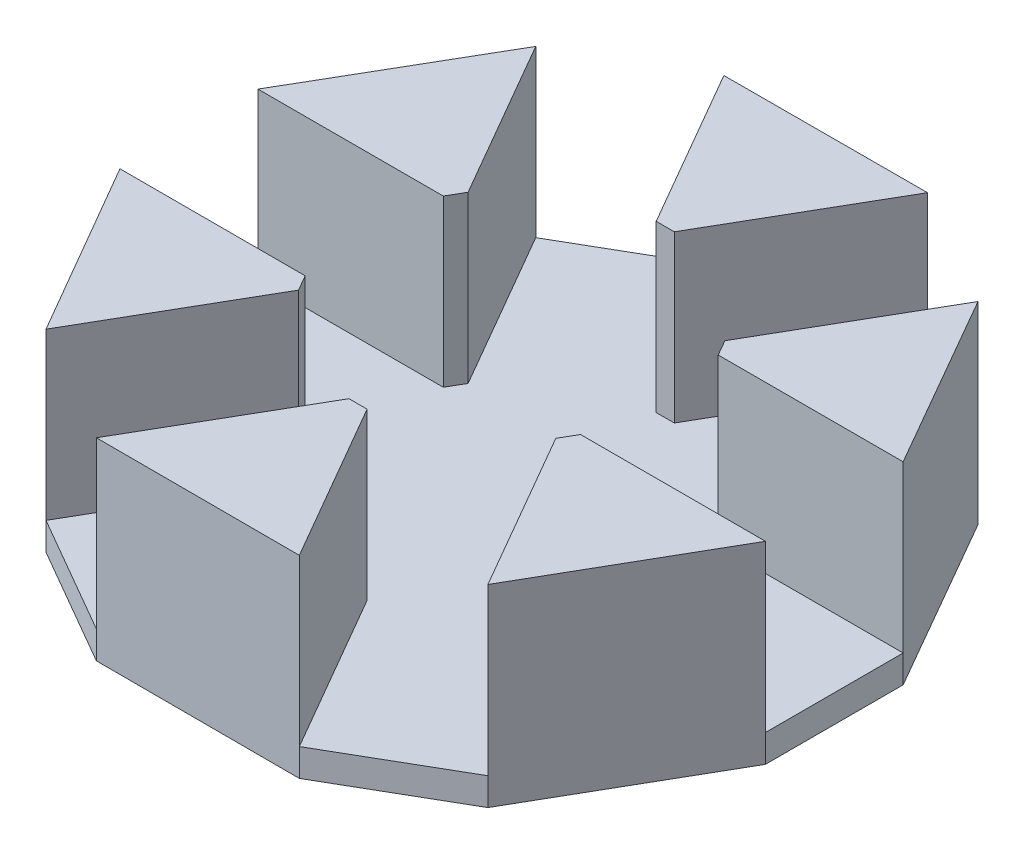
ISO-10303-21;
HEADER;
FILE_DESCRIPTION(('STEP AP214'),'2;1');
FILE_NAME('part.step','',(''),(''),'','','');
FILE_SCHEMA(('AUTOMOTIVE_DESIGN { 1 0 10303 214 1 1 1 1 }'));
ENDSEC;
DATA;
#1=APPLICATION_CONTEXT('core data for automotive mechanical design processes');
#2=APPLICATION_PROTOCOL_DEFINITION('international standard','automotive_design',2000,#1);
#3=PRODUCT_CONTEXT('',#1,'mechanical');
#4=PRODUCT('Part','Part','',(#3));
#5=PRODUCT_RELATED_PRODUCT_CATEGORY('part','',(#4));
#6=PRODUCT_DEFINITION_FORMATION('','',#4);
#7=PRODUCT_DEFINITION_CONTEXT('part definition',#1,'design');
#8=PRODUCT_DEFINITION('design','',#6,#7);
#9=PRODUCT_DEFINITION_SHAPE('','',#8);
#10=(LENGTH_UNIT() NAMED_UNIT(*) SI_UNIT(.MILLI.,.METRE.));
#11=(NAMED_UNIT(*) PLANE_ANGLE_UNIT() SI_UNIT($,.RADIAN.));
#12=(NAMED_UNIT(*) SI_UNIT($,.STERADIAN.) SOLID_ANGLE_UNIT());
#13=UNCERTAINTY_MEASURE_WITH_UNIT(LENGTH_MEASURE(1.E-05),#10,'distance_accuracy_value','');
#14=(GEOMETRIC_REPRESENTATION_CONTEXT(3) GLOBAL_UNCERTAINTY_ASSIGNED_CONTEXT((#13)) GLOBAL_UNIT_ASSIGNED_CONTEXT((#10,
#11,#12)) REPRESENTATION_CONTEXT('',''));
#15=CARTESIAN_POINT('',(0.,0.,0.));
#16=DIRECTION('',(0.,0.,1.));
#17=DIRECTION('',(1.,0.,0.));
#18=AXIS2_PLACEMENT_3D('',#15,#16,#17);
#19=CARTESIAN_POINT('',(0.,0.,0.));
#20=DIRECTION('',(0.,1.,0.));
#21=DIRECTION('',(0.,0.,1.));
#22=AXIS2_PLACEMENT_3D('',#19,#20,#21);
#23=PLANE('',#22);
#24=DIRECTION('',(0.999999999997192,0.,-2.36997962910476E-06));
#25=VECTOR('',#24,1.);
#26=CARTESIAN_POINT('',(0.000351703674284998,0.,148.39945034332));
#27=LINE('',#26,#25);
#28=CARTESIAN_POINT('',(485.169129802253,0.,148.398300503199));
#29=VERTEX_POINT('',#28);
#30=CARTESIAN_POINT('',(501.916601620134,0.,148.398260812032));
#31=VERTEX_POINT('',#30);
#32=EDGE_CURVE('E238',#29,#31,#27,.T.);
#33=ORIENTED_EDGE('',*,*,#32,.T.);
#34=DIRECTION('',(-1.21650143619216E-05,0.,0.999999999926006));
#35=VECTOR('',#34,1.);
#36=CARTESIAN_POINT('',(501.91840681283,0.,0.0061058446278427));
#37=LINE('',#36,#35);
#38=CARTESIAN_POINT('',(501.916753350918,0.,135.925543561818));
#39=VERTEX_POINT('',#38);
#40=EDGE_CURVE('E447',#39,#31,#37,.T.);
#41=ORIENTED_EDGE('',*,*,#40,.F.);
#42=DIRECTION('',(0.999999999643555,0.,2.67000083539015E-05));
#43=VECTOR('',#42,1.);
#44=CARTESIAN_POINT('',(-0.00362885533565732,0.,135.912142283415));
#45=LINE('',#44,#43);
#46=CARTESIAN_POINT('',(485.16928153896,0.,135.92509640418));
#47=VERTEX_POINT('',#46);
#48=EDGE_CURVE('E283',#47,#39,#45,.T.);
#49=ORIENTED_EDGE('',*,*,#48,.F.);
#50=DIRECTION('',(-0.498430663397825,0.,-0.866929566795829));
#51=VECTOR('',#50,1.);
#52=CARTESIAN_POINT('',(305.903344389705,0.,-175.875426008723));
#53=LINE('',#52,#51);
#54=CARTESIAN_POINT('',(484.351348130903,0.,134.502449871399));
#55=VERTEX_POINT('',#54);
#56=EDGE_CURVE('E240',#47,#55,#53,.T.);
#57=ORIENTED_EDGE('',*,*,#56,.T.);
#58=DIRECTION('',(0.499726983316557,0.,-0.866182972671095));
#59=VECTOR('',#58,1.);
#60=CARTESIAN_POINT('',(421.615769462326,0.,243.24280578083));
#61=LINE('',#60,#59);
#62=CARTESIAN_POINT('',(492.7380485147,0.,119.965678170323));
#63=VERTEX_POINT('',#62);
#64=EDGE_CURVE('E272',#55,#63,#61,.T.);
#65=ORIENTED_EDGE('',*,*,#64,.T.);
#66=DIRECTION('',(0.866025798780777,0.,0.499999315845649));
#67=VECTOR('',#66,1.);
#68=CARTESIAN_POINT('',(71.2375599672626,0.,-123.387298379598));
#69=LINE('',#68,#67);
#70=CARTESIAN_POINT('',(481.912449677161,0.,113.715527170192));
#71=VERTEX_POINT('',#70);
#72=EDGE_CURVE('E449',#71,#63,#69,.T.);
#73=ORIENTED_EDGE('',*,*,#72,.F.);
#74=DIRECTION('',(0.500271598940486,0.,-0.86586853926767));
#75=VECTOR('',#74,1.);
#76=CARTESIAN_POINT('',(410.561505864131,0.,237.209520484227));
#77=LINE('',#76,#75);
#78=CARTESIAN_POINT('',(473.516609246468,0.,128.24702187236));
#79=VERTEX_POINT('',#78);
#80=EDGE_CURVE('E300',#79,#71,#77,.T.);
#81=ORIENTED_EDGE('',*,*,#80,.F.);
#82=DIRECTION('',(0.999998356973072,0.,-0.00181274685410892));
#83=VECTOR('',#82,1.);
#84=CARTESIAN_POINT('',(0.234035003279779,0.,129.104964779547));
#85=LINE('',#84,#83);
#86=CARTESIAN_POINT('',(471.875594509142,0.,128.24999662155));
#87=VERTEX_POINT('',#86);
#88=EDGE_CURVE('E309',#87,#79,#85,.T.);
#89=ORIENTED_EDGE('',*,*,#88,.F.);
#90=DIRECTION('',(-0.500024490993863,0.,-0.866011263440799));
#91=VECTOR('',#90,1.);
#92=CARTESIAN_POINT('',(298.359447975985,0.,-172.269157926028));
#93=LINE('',#92,#91);
#94=CARTESIAN_POINT('',(463.501448437951,0.,113.746497393071));
#95=VERTEX_POINT('',#94);
#96=EDGE_CURVE('E295',#87,#95,#93,.T.);
#97=ORIENTED_EDGE('',*,*,#96,.T.);
#98=DIRECTION('',(0.866018531202406,0.,-0.500011903472334));
#99=VECTOR('',#98,1.);
#100=CARTESIAN_POINT('',(165.135339322999,0.,286.013718907449));
#101=LINE('',#100,#99);
#102=CARTESIAN_POINT('',(452.699844164017,0.,119.983004487285));
#103=VERTEX_POINT('',#102);
#104=EDGE_CURVE('E452',#103,#95,#101,.T.);
#105=ORIENTED_EDGE('',*,*,#104,.F.);
#106=DIRECTION('',(-0.499999315845888,0.,-0.866025798780639));
#107=VECTOR('',#106,1.);
#108=CARTESIAN_POINT('',(287.571075278003,0.,-166.028934817551));
#109=LINE('',#108,#107);
#110=CARTESIAN_POINT('',(461.073568615131,0.,134.486747145965));
#111=VERTEX_POINT('',#110);
#112=EDGE_CURVE('E341',#111,#103,#109,.T.);
#113=ORIENTED_EDGE('',*,*,#112,.F.);
#114=DIRECTION('',(-0.501545281038339,0.,0.865131395262115));
#115=VECTOR('',#114,1.);
#116=CARTESIAN_POINT('',(403.445732276318,0.,233.89083356169));
#117=LINE('',#116,#115);
#118=CARTESIAN_POINT('',(460.250524065227,0.,135.90644284791));
#119=VERTEX_POINT('',#118);
#120=EDGE_CURVE('E325',#111,#119,#117,.T.);
#121=ORIENTED_EDGE('',*,*,#120,.T.);
#122=DIRECTION('',(-0.99999994181385,0.,0.000341133840615383));
#123=VECTOR('',#122,1.);
#124=CARTESIAN_POINT('',(0.0464158445262186,0.,136.063434051949));
#125=LINE('',#124,#123);
#126=CARTESIAN_POINT('',(443.467960433879,0.,135.91216794863));
#127=VERTEX_POINT('',#126);
#128=EDGE_CURVE('E330',#119,#127,#125,.T.);
#129=ORIENTED_EDGE('',*,*,#128,.T.);
#130=DIRECTION('',(-1.95396962924914E-13,0.,-1.));
#131=VECTOR('',#130,1.);
#132=CARTESIAN_POINT('',(443.467960433853,0.,-8.66522926232808E-11));
#133=LINE('',#132,#131);
#134=CARTESIAN_POINT('',(443.467960433882,0.,148.412314407477));
#135=VERTEX_POINT('',#134);
#136=EDGE_CURVE('E418',#135,#127,#133,.T.);
#137=ORIENTED_EDGE('',*,*,#136,.F.);
#138=DIRECTION('',(-0.99999994181385,0.,-0.000341133840698274));
#139=VECTOR('',#138,1.);
#140=CARTESIAN_POINT('',(-0.0505768524895459,0.,148.261015216628));
#141=LINE('',#140,#139);
#142=CARTESIAN_POINT('',(460.25052406522,0.,148.418039508199));
#143=VERTEX_POINT('',#142);
#144=EDGE_CURVE('E358',#143,#135,#141,.T.);
#145=ORIENTED_EDGE('',*,*,#144,.F.);
#146=DIRECTION('',(-0.501545281038921,0.,-0.865131395261777));
#147=VECTOR('',#146,1.);
#148=CARTESIAN_POINT('',(280.076609016958,0.,-162.369672804827));
#149=LINE('',#148,#147);
#150=CARTESIAN_POINT('',(461.073568615126,0.,149.837735210145));
#151=VERTEX_POINT('',#150);
#152=EDGE_CURVE('E367',#151,#143,#149,.T.);
#153=ORIENTED_EDGE('',*,*,#152,.F.);
#154=DIRECTION('',(-0.499999315845681,0.,0.866025798780759));
#155=VECTOR('',#154,1.);
#156=CARTESIAN_POINT('',(410.687075289882,0.,237.109860884859));
#157=LINE('',#156,#155);
#158=CARTESIAN_POINT('',(452.699844164017,0.,164.341477868824));
#159=VERTEX_POINT('',#158);
#160=EDGE_CURVE('E353',#151,#159,#157,.T.);
#161=ORIENTED_EDGE('',*,*,#160,.T.);
#162=DIRECTION('',(0.866025798780775,0.,0.499999315845652));
#163=VECTOR('',#162,1.);
#164=CARTESIAN_POINT('',(42.0127688741245,0.,-72.7683830160228));
#165=LINE('',#164,#163);
#166=CARTESIAN_POINT('',(463.501071841566,0.,170.577558198845));
#167=VERTEX_POINT('',#166);
#168=EDGE_CURVE('E413',#159,#167,#165,.T.);
#169=ORIENTED_EDGE('',*,*,#168,.T.);
#170=DIRECTION('',(-0.499999315845627,0.,0.86602579878079));
#171=VECTOR('',#170,1.);
#172=CARTESIAN_POINT('',(421.488302967451,0.,243.345941214857));
#173=LINE('',#172,#171);
#174=CARTESIAN_POINT('',(471.874796292674,0.,156.073815540165));
#175=VERTEX_POINT('',#174);
#176=EDGE_CURVE('E398',#175,#167,#173,.T.);
#177=ORIENTED_EDGE('',*,*,#176,.F.);
#178=DIRECTION('',(0.99999840924707,0.,0.00178367691305995));
#179=VECTOR('',#178,1.);
#180=CARTESIAN_POINT('',(-0.276883547434164,0.,155.231648149692));
#181=LINE('',#180,#179);
#182=CARTESIAN_POINT('',(473.515811115782,0.,156.076742585075));
#183=VERTEX_POINT('',#182);
#184=EDGE_CURVE('E383',#175,#183,#181,.T.);
#185=ORIENTED_EDGE('',*,*,#184,.T.);
#186=DIRECTION('',(0.500296769517255,0.,0.865853996012375));
#187=VECTOR('',#186,1.);
#188=CARTESIAN_POINT('',(287.386350613665,0.,-166.053934586582));
#189=LINE('',#188,#187);
#190=CARTESIAN_POINT('',(481.912073973305,0.,170.607993214119));
#191=VERTEX_POINT('',#190);
#192=EDGE_CURVE('E388',#183,#191,#189,.T.);
#193=ORIENTED_EDGE('',*,*,#192,.T.);
#194=DIRECTION('',(-0.86602461379031,0.,0.500001368307472));
#195=VECTOR('',#194,1.);
#196=CARTESIAN_POINT('',(194.354240782935,0.,336.630191397888));
#197=LINE('',#196,#195);
#198=CARTESIAN_POINT('',(492.737508482652,0.,164.357902880651));
#199=VERTEX_POINT('',#198);
#200=EDGE_CURVE('E444',#199,#191,#197,.T.);
#201=ORIENTED_EDGE('',*,*,#200,.F.);
#202=DIRECTION('',(0.499705908912137,0.,0.866195130786531));
#203=VECTOR('',#202,1.);
#204=CARTESIAN_POINT('',(298.556859440762,0.,-172.236741475711));
#205=LINE('',#204,#203);
#206=CARTESIAN_POINT('',(484.351161781406,0.,149.820927135216));
#207=VERTEX_POINT('',#206);
#208=EDGE_CURVE('E55',#207,#199,#205,.T.);
#209=ORIENTED_EDGE('',*,*,#208,.F.);
#210=DIRECTION('',(-0.498451755671583,0.,0.866917439706871));
#211=VECTOR('',#210,1.);
#212=CARTESIAN_POINT('',(428.752201889708,0.,246.519769924394));
#213=LINE('',#212,#211);
#214=EDGE_CURVE('E50',#29,#207,#213,.T.);
#215=ORIENTED_EDGE('',*,*,#214,.F.);
#216=EDGE_LOOP('',(#33,#41,#49,#57,#65,#73,#81,#89,#97,#105,#113,#121,#129,#137,#145,#153,#161,
#169,#177,#185,#193,#201,#209,#215));
#217=FACE_BOUND('',#216,.T.);
#218=ADVANCED_FACE('F33',(#217),#23,.T.);
#219=CARTESIAN_POINT('',(42.0127688741245,-2.5,-72.7683830160228));
#220=DIRECTION('',(-0.499999315845652,0.,0.866025798780775));
#221=DIRECTION('',(0.866025798780775,0.,0.499999315845652));
#222=AXIS2_PLACEMENT_3D('',#219,#220,#221);
#223=PLANE('',#222);
#224=ORIENTED_EDGE('',*,*,#168,.F.);
#225=DIRECTION('',(0.,1.,0.));
#226=VECTOR('',#225,1.);
#227=CARTESIAN_POINT('',(452.699844164017,-2.5,164.341477868824));
#228=LINE('',#227,#226);
#229=CARTESIAN_POINT('',(452.699844164017,-2.5,164.341477868824));
#230=VERTEX_POINT('',#229);
#231=EDGE_CURVE('E11',#230,#159,#228,.T.);
#232=ORIENTED_EDGE('',*,*,#231,.F.);
#233=DIRECTION('',(0.866025798780775,0.,0.499999315845652));
#234=VECTOR('',#233,1.);
#235=CARTESIAN_POINT('',(42.0127688741245,-2.5,-72.7683830160228));
#236=LINE('',#235,#234);
#237=CARTESIAN_POINT('',(463.501071841566,-2.5,170.577558198845));
#238=VERTEX_POINT('',#237);
#239=EDGE_CURVE('E414',#230,#238,#236,.T.);
#240=ORIENTED_EDGE('',*,*,#239,.T.);
#241=DIRECTION('',(0.,1.,0.));
#242=VECTOR('',#241,1.);
#243=CARTESIAN_POINT('',(463.501071841566,-2.5,170.577558198845));
#244=LINE('',#243,#242);
#245=EDGE_CURVE('E37',#238,#167,#244,.T.);
#246=ORIENTED_EDGE('',*,*,#245,.T.);
#247=EDGE_LOOP('',(#224,#232,#240,#246));
#248=FACE_BOUND('',#247,.T.);
#249=ADVANCED_FACE('F35',(#248),#223,.T.);
#250=CARTESIAN_POINT('',(267.578030470802,-2.5,-155.077149659439));
#251=DIRECTION('',(-0.86519688513354,0.,0.501432298476295));
#252=DIRECTION('',(0.501432298476295,0.,0.86519688513354));
#253=AXIS2_PLACEMENT_3D('',#250,#251,#252);
#254=PLANE('',#253);
#255=ORIENTED_EDGE('',*,*,#231,.T.);
#256=DIRECTION('',(0.,-1.,0.));
#257=VECTOR('',#256,1.);
#258=CARTESIAN_POINT('',(452.699844164017,15.,164.341477868824));
#259=LINE('',#258,#257);
#260=CARTESIAN_POINT('',(452.699844164017,15.,164.341477868824));
#261=VERTEX_POINT('',#260);
#262=EDGE_CURVE('E364',#261,#159,#259,.T.);
#263=ORIENTED_EDGE('',*,*,#262,.F.);
#264=DIRECTION('',(0.501432298476295,0.,0.86519688513354));
#265=VECTOR('',#264,1.);
#266=CARTESIAN_POINT('',(267.578030470802,15.,-155.077149659439));
#267=LINE('',#266,#265);
#268=CARTESIAN_POINT('',(443.467960433882,15.,148.412314407477));
#269=VERTEX_POINT('',#268);
#270=EDGE_CURVE('E362',#269,#261,#267,.T.);
#271=ORIENTED_EDGE('',*,*,#270,.F.);
#272=DIRECTION('',(0.,-1.,0.));
#273=VECTOR('',#272,1.);
#274=CARTESIAN_POINT('',(443.467960433882,15.,148.412314407477));
#275=LINE('',#274,#273);
#276=EDGE_CURVE('E374',#269,#135,#275,.T.);
#277=ORIENTED_EDGE('',*,*,#276,.T.);
#278=DIRECTION('',(0.,1.,0.));
#279=VECTOR('',#278,1.);
#280=CARTESIAN_POINT('',(443.467960433882,-2.5,148.412314407477));
#281=LINE('',#280,#279);
#282=CARTESIAN_POINT('',(443.467960433882,-2.5,148.412314407477));
#283=VERTEX_POINT('',#282);
#284=EDGE_CURVE('E42',#283,#135,#281,.T.);
#285=ORIENTED_EDGE('',*,*,#284,.F.);
#286=DIRECTION('',(0.501432298476295,0.,0.86519688513354));
#287=VECTOR('',#286,1.);
#288=CARTESIAN_POINT('',(267.578030470802,-2.5,-155.077149659439));
#289=LINE('',#288,#287);
#290=EDGE_CURVE('E440',#283,#230,#289,.T.);
#291=ORIENTED_EDGE('',*,*,#290,.T.);
#292=EDGE_LOOP('',(#255,#263,#271,#277,#285,#291));
#293=FACE_BOUND('',#292,.T.);
#294=ADVANCED_FACE('F501',(#293),#254,.T.);
#295=CARTESIAN_POINT('',(443.467960433853,-2.5,-8.66522926232808E-11));
#296=DIRECTION('',(1.,0.,-1.95396962924914E-13));
#297=DIRECTION('',(-1.95396962924914E-13,0.,-1.));
#298=AXIS2_PLACEMENT_3D('',#295,#296,#297);
#299=PLANE('',#298);
#300=ORIENTED_EDGE('',*,*,#136,.T.);
#301=DIRECTION('',(0.,1.,0.));
#302=VECTOR('',#301,1.);
#303=CARTESIAN_POINT('',(443.467960433879,-2.5,135.91216794863));
#304=LINE('',#303,#302);
#305=CARTESIAN_POINT('',(443.467960433879,-2.5,135.91216794863));
#306=VERTEX_POINT('',#305);
#307=EDGE_CURVE('E457',#306,#127,#304,.T.);
#308=ORIENTED_EDGE('',*,*,#307,.F.);
#309=DIRECTION('',(-1.95396962924914E-13,0.,-1.));
#310=VECTOR('',#309,1.);
#311=CARTESIAN_POINT('',(443.467960433853,-2.5,-8.66522926232808E-11));
#312=LINE('',#311,#310);
#313=EDGE_CURVE('E438',#283,#306,#312,.T.);
#314=ORIENTED_EDGE('',*,*,#313,.F.);
#315=ORIENTED_EDGE('',*,*,#284,.T.);
#316=EDGE_LOOP('',(#300,#308,#314,#315));
#317=FACE_BOUND('',#316,.T.);
#318=ADVANCED_FACE('F563',(#317),#299,.F.);
#319=CARTESIAN_POINT('',(390.928699357888,-2.5,226.566091057053));
#320=DIRECTION('',(0.865196885133462,0.,0.501432298476429));
#321=DIRECTION('',(0.501432298476429,0.,-0.865196885133463));
#322=AXIS2_PLACEMENT_3D('',#319,#320,#321);
#323=PLANE('',#322);
#324=ORIENTED_EDGE('',*,*,#307,.T.);
#325=DIRECTION('',(0.,-1.,0.));
#326=VECTOR('',#325,1.);
#327=CARTESIAN_POINT('',(443.467960433879,15.,135.91216794863));
#328=LINE('',#327,#326);
#329=CARTESIAN_POINT('',(443.467960433879,15.,135.91216794863));
#330=VERTEX_POINT('',#329);
#331=EDGE_CURVE('E346',#330,#127,#328,.T.);
#332=ORIENTED_EDGE('',*,*,#331,.F.);
#333=DIRECTION('',(0.501432298476429,0.,-0.865196885133462));
#334=VECTOR('',#333,1.);
#335=CARTESIAN_POINT('',(390.928699357888,15.,226.566091057053));
#336=LINE('',#335,#334);
#337=CARTESIAN_POINT('',(452.699844164017,15.,119.983004487285));
#338=VERTEX_POINT('',#337);
#339=EDGE_CURVE('E332',#330,#338,#336,.T.);
#340=ORIENTED_EDGE('',*,*,#339,.T.);
#341=DIRECTION('',(0.,-1.,0.));
#342=VECTOR('',#341,1.);
#343=CARTESIAN_POINT('',(452.699844164017,15.,119.983004487285));
#344=LINE('',#343,#342);
#345=EDGE_CURVE('E348',#338,#103,#344,.T.);
#346=ORIENTED_EDGE('',*,*,#345,.T.);
#347=DIRECTION('',(0.,1.,0.));
#348=VECTOR('',#347,1.);
#349=CARTESIAN_POINT('',(452.699844164017,-2.5,119.983004487285));
#350=LINE('',#349,#348);
#351=CARTESIAN_POINT('',(452.699844164017,-2.5,119.983004487285));
#352=VERTEX_POINT('',#351);
#353=EDGE_CURVE('E460',#352,#103,#350,.T.);
#354=ORIENTED_EDGE('',*,*,#353,.F.);
#355=DIRECTION('',(0.501432298476429,0.,-0.865196885133462));
#356=VECTOR('',#355,1.);
#357=CARTESIAN_POINT('',(390.928699357888,-2.5,226.566091057053));
#358=LINE('',#357,#356);
#359=EDGE_CURVE('E436',#306,#352,#358,.T.);
#360=ORIENTED_EDGE('',*,*,#359,.F.);
#361=EDGE_LOOP('',(#324,#332,#340,#346,#354,#360));
#362=FACE_BOUND('',#361,.T.);
#363=ADVANCED_FACE('F566',(#362),#323,.F.);
#364=CARTESIAN_POINT('',(165.135339322999,-2.5,286.013718907449));
#365=DIRECTION('',(0.500011903472334,0.,0.866018531202407));
#366=DIRECTION('',(0.866018531202407,0.,-0.500011903472334));
#367=AXIS2_PLACEMENT_3D('',#364,#365,#366);
#368=PLANE('',#367);
#369=ORIENTED_EDGE('',*,*,#104,.T.);
#370=DIRECTION('',(0.,1.,0.));
#371=VECTOR('',#370,1.);
#372=CARTESIAN_POINT('',(463.501448437951,-2.5,113.746497393071));
#373=LINE('',#372,#371);
#374=CARTESIAN_POINT('',(463.501448437951,-2.5,113.746497393071));
#375=VERTEX_POINT('',#374);
#376=EDGE_CURVE('E463',#375,#95,#373,.T.);
#377=ORIENTED_EDGE('',*,*,#376,.F.);
#378=DIRECTION('',(0.866018531202406,0.,-0.500011903472334));
#379=VECTOR('',#378,1.);
#380=CARTESIAN_POINT('',(165.135339322999,-2.5,286.013718907449));
#381=LINE('',#380,#379);
#382=EDGE_CURVE('E434',#352,#375,#381,.T.);
#383=ORIENTED_EDGE('',*,*,#382,.F.);
#384=ORIENTED_EDGE('',*,*,#353,.T.);
#385=EDGE_LOOP('',(#369,#377,#383,#384));
#386=FACE_BOUND('',#385,.T.);
#387=ADVANCED_FACE('F570',(#386),#368,.F.);
#388=CARTESIAN_POINT('',(0.192650646593095,-2.5,114.525856241769));
#389=DIRECTION('',(-0.00168215615536916,0.,-0.999998585174334));
#390=DIRECTION('',(-0.999998585174334,0.,0.00168215615536916));
#391=AXIS2_PLACEMENT_3D('',#388,#389,#390);
#392=PLANE('',#391);
#393=ORIENTED_EDGE('',*,*,#376,.T.);
#394=DIRECTION('',(0.,-1.,0.));
#395=VECTOR('',#394,1.);
#396=CARTESIAN_POINT('',(463.501448437951,15.,113.746497393071));
#397=LINE('',#396,#395);
#398=CARTESIAN_POINT('',(463.501448437951,15.,113.746497393071));
#399=VERTEX_POINT('',#398);
#400=EDGE_CURVE('E306',#399,#95,#397,.T.);
#401=ORIENTED_EDGE('',*,*,#400,.F.);
#402=DIRECTION('',(-0.999998585174334,0.,0.00168215615536916));
#403=VECTOR('',#402,1.);
#404=CARTESIAN_POINT('',(0.192650646593095,15.,114.525856241769));
#405=LINE('',#404,#403);
#406=CARTESIAN_POINT('',(481.912449677161,15.,113.715527170192));
#407=VERTEX_POINT('',#406);
#408=EDGE_CURVE('E304',#407,#399,#405,.T.);
#409=ORIENTED_EDGE('',*,*,#408,.F.);
#410=DIRECTION('',(0.,-1.,0.));
#411=VECTOR('',#410,1.);
#412=CARTESIAN_POINT('',(481.912449677161,15.,113.715527170192));
#413=LINE('',#412,#411);
#414=EDGE_CURVE('E316',#407,#71,#413,.T.);
#415=ORIENTED_EDGE('',*,*,#414,.T.);
#416=DIRECTION('',(0.,1.,0.));
#417=VECTOR('',#416,1.);
#418=CARTESIAN_POINT('',(481.912449677161,-2.5,113.715527170192));
#419=LINE('',#418,#417);
#420=CARTESIAN_POINT('',(481.912449677161,-2.5,113.715527170192));
#421=VERTEX_POINT('',#420);
#422=EDGE_CURVE('E466',#421,#71,#419,.T.);
#423=ORIENTED_EDGE('',*,*,#422,.F.);
#424=DIRECTION('',(-0.999998585174334,0.,0.00168215615536916));
#425=VECTOR('',#424,1.);
#426=CARTESIAN_POINT('',(0.192650646593095,-2.5,114.525856241769));
#427=LINE('',#426,#425);
#428=EDGE_CURVE('E431',#421,#375,#427,.T.);
#429=ORIENTED_EDGE('',*,*,#428,.T.);
#430=EDGE_LOOP('',(#393,#401,#409,#415,#423,#429));
#431=FACE_BOUND('',#430,.T.);
#432=ADVANCED_FACE('F574',(#431),#392,.T.);
#433=CARTESIAN_POINT('',(71.2375599672626,-2.5,-123.387298379598));
#434=DIRECTION('',(-0.499999315845649,0.,0.866025798780777));
#435=DIRECTION('',(0.866025798780777,0.,0.499999315845649));
#436=AXIS2_PLACEMENT_3D('',#433,#434,#435);
#437=PLANE('',#436);
#438=ORIENTED_EDGE('',*,*,#72,.T.);
#439=DIRECTION('',(0.,1.,0.));
#440=VECTOR('',#439,1.);
#441=CARTESIAN_POINT('',(492.7380485147,-2.5,119.965678170323));
#442=LINE('',#441,#440);
#443=CARTESIAN_POINT('',(492.7380485147,-2.5,119.965678170323));
#444=VERTEX_POINT('',#443);
#445=EDGE_CURVE('E468',#444,#63,#442,.T.);
#446=ORIENTED_EDGE('',*,*,#445,.F.);
#447=DIRECTION('',(0.866025798780777,0.,0.499999315845649));
#448=VECTOR('',#447,1.);
#449=CARTESIAN_POINT('',(71.2375599672626,-2.5,-123.387298379598));
#450=LINE('',#449,#448);
#451=EDGE_CURVE('E429',#421,#444,#450,.T.);
#452=ORIENTED_EDGE('',*,*,#451,.F.);
#453=ORIENTED_EDGE('',*,*,#422,.T.);
#454=EDGE_LOOP('',(#438,#446,#452,#453));
#455=FACE_BOUND('',#454,.T.);
#456=ADVANCED_FACE('F539',(#455),#437,.F.);
#457=CARTESIAN_POINT('',(318.424417749914,-2.5,-183.129598619837));
#458=DIRECTION('',(-0.866864468895604,0.,0.498543872258343));
#459=DIRECTION('',(0.498543872258343,0.,0.866864468895604));
#460=AXIS2_PLACEMENT_3D('',#457,#458,#459);
#461=PLANE('',#460);
#462=ORIENTED_EDGE('',*,*,#445,.T.);
#463=DIRECTION('',(0.,-1.,0.));
#464=VECTOR('',#463,1.);
#465=CARTESIAN_POINT('',(492.7380485147,15.,119.965678170323));
#466=LINE('',#465,#464);
#467=CARTESIAN_POINT('',(492.7380485147,15.,119.965678170323));
#468=VERTEX_POINT('',#467);
#469=EDGE_CURVE('E288',#468,#63,#466,.T.);
#470=ORIENTED_EDGE('',*,*,#469,.F.);
#471=DIRECTION('',(0.498543872258343,0.,0.866864468895604));
#472=VECTOR('',#471,1.);
#473=CARTESIAN_POINT('',(318.424417749914,15.,-183.129598619837));
#474=LINE('',#473,#472);
#475=CARTESIAN_POINT('',(501.916753350918,15.,135.925543561818));
#476=VERTEX_POINT('',#475);
#477=EDGE_CURVE('E274',#468,#476,#474,.T.);
#478=ORIENTED_EDGE('',*,*,#477,.T.);
#479=DIRECTION('',(0.,-1.,0.));
#480=VECTOR('',#479,1.);
#481=CARTESIAN_POINT('',(501.916753350918,15.,135.925543561818));
#482=LINE('',#481,#480);
#483=EDGE_CURVE('E290',#476,#39,#482,.T.);
#484=ORIENTED_EDGE('',*,*,#483,.T.);
#485=DIRECTION('',(0.,1.,0.));
#486=VECTOR('',#485,1.);
#487=CARTESIAN_POINT('',(501.916753350918,-2.5,135.925543561818));
#488=LINE('',#487,#486);
#489=CARTESIAN_POINT('',(501.916753350918,-2.5,135.925543561818));
#490=VERTEX_POINT('',#489);
#491=EDGE_CURVE('E471',#490,#39,#488,.T.);
#492=ORIENTED_EDGE('',*,*,#491,.F.);
#493=DIRECTION('',(0.498543872258343,0.,0.866864468895604));
#494=VECTOR('',#493,1.);
#495=CARTESIAN_POINT('',(318.424417749914,-2.5,-183.129598619837));
#496=LINE('',#495,#494);
#497=EDGE_CURVE('E427',#444,#490,#496,.T.);
#498=ORIENTED_EDGE('',*,*,#497,.F.);
#499=EDGE_LOOP('',(#462,#470,#478,#484,#492,#498));
#500=FACE_BOUND('',#499,.T.);
#501=ADVANCED_FACE('F524',(#500),#461,.F.);
#502=CARTESIAN_POINT('',(501.91840681283,-2.5,0.0061058446278427));
#503=DIRECTION('',(-0.999999999926006,0.,-1.21650143619216E-05));
#504=DIRECTION('',(-1.21650143619216E-05,0.,0.999999999926006));
#505=AXIS2_PLACEMENT_3D('',#502,#503,#504);
#506=PLANE('',#505);
#507=ORIENTED_EDGE('',*,*,#40,.T.);
#508=DIRECTION('',(0.,1.,0.));
#509=VECTOR('',#508,1.);
#510=CARTESIAN_POINT('',(501.916601620134,-2.5,148.398260812032));
#511=LINE('',#510,#509);
#512=CARTESIAN_POINT('',(501.916601620134,-2.5,148.398260812032));
#513=VERTEX_POINT('',#512);
#514=EDGE_CURVE('E474',#513,#31,#511,.T.);
#515=ORIENTED_EDGE('',*,*,#514,.F.);
#516=DIRECTION('',(-1.21650143619216E-05,0.,0.999999999926006));
#517=VECTOR('',#516,1.);
#518=CARTESIAN_POINT('',(501.91840681283,-2.5,0.0061058446278427));
#519=LINE('',#518,#517);
#520=EDGE_CURVE('E425',#490,#513,#519,.T.);
#521=ORIENTED_EDGE('',*,*,#520,.F.);
#522=ORIENTED_EDGE('',*,*,#491,.T.);
#523=EDGE_LOOP('',(#507,#515,#521,#522));
#524=FACE_BOUND('',#523,.T.);
#525=ADVANCED_FACE('F520',(#524),#506,.F.);
#526=CARTESIAN_POINT('',(441.291773994998,-2.5,253.806337065009));
#527=DIRECTION('',(0.866852339052368,0.,0.498564962948098));
#528=DIRECTION('',(0.498564962948098,0.,-0.866852339052368));
#529=AXIS2_PLACEMENT_3D('',#526,#527,#528);
#530=PLANE('',#529);
#531=ORIENTED_EDGE('',*,*,#514,.T.);
#532=DIRECTION('',(0.,-1.,0.));
#533=VECTOR('',#532,1.);
#534=CARTESIAN_POINT('',(501.916601620134,15.,148.398260812032));
#535=LINE('',#534,#533);
#536=CARTESIAN_POINT('',(501.916601620134,15.,148.398260812032));
#537=VERTEX_POINT('',#536);
#538=EDGE_CURVE('E260',#537,#31,#535,.T.);
#539=ORIENTED_EDGE('',*,*,#538,.F.);
#540=DIRECTION('',(0.498564962948098,0.,-0.866852339052368));
#541=VECTOR('',#540,1.);
#542=CARTESIAN_POINT('',(441.291773994998,15.,253.806337065009));
#543=LINE('',#542,#541);
#544=CARTESIAN_POINT('',(492.737508482652,15.,164.357902880651));
#545=VERTEX_POINT('',#544);
#546=EDGE_CURVE('E253',#545,#537,#543,.T.);
#547=ORIENTED_EDGE('',*,*,#546,.F.);
#548=DIRECTION('',(0.,-1.,0.));
#549=VECTOR('',#548,1.);
#550=CARTESIAN_POINT('',(492.737508482652,15.,164.357902880651));
#551=LINE('',#550,#549);
#552=EDGE_CURVE('E264',#545,#199,#551,.T.);
#553=ORIENTED_EDGE('',*,*,#552,.T.);
#554=DIRECTION('',(0.,1.,0.));
#555=VECTOR('',#554,1.);
#556=CARTESIAN_POINT('',(492.737508482652,-2.5,164.357902880651));
#557=LINE('',#556,#555);
#558=CARTESIAN_POINT('',(492.737508482652,-2.5,164.357902880651));
#559=VERTEX_POINT('',#558);
#560=EDGE_CURVE('E477',#559,#199,#557,.T.);
#561=ORIENTED_EDGE('',*,*,#560,.F.);
#562=DIRECTION('',(0.498564962948098,0.,-0.866852339052368));
#563=VECTOR('',#562,1.);
#564=CARTESIAN_POINT('',(441.291773994998,-2.5,253.806337065009));
#565=LINE('',#564,#563);
#566=EDGE_CURVE('E422',#559,#513,#565,.T.);
#567=ORIENTED_EDGE('',*,*,#566,.T.);
#568=EDGE_LOOP('',(#531,#539,#547,#553,#561,#567));
#569=FACE_BOUND('',#568,.T.);
#570=ADVANCED_FACE('F514',(#569),#530,.T.);
#571=CARTESIAN_POINT('',(194.354240782935,-2.5,336.630191397888));
#572=DIRECTION('',(-0.500001368307472,0.,-0.86602461379031));
#573=DIRECTION('',(-0.86602461379031,0.,0.500001368307472));
#574=AXIS2_PLACEMENT_3D('',#571,#572,#573);
#575=PLANE('',#574);
#576=ORIENTED_EDGE('',*,*,#200,.T.);
#577=DIRECTION('',(0.,1.,0.));
#578=VECTOR('',#577,1.);
#579=CARTESIAN_POINT('',(481.912073973305,-2.5,170.607993214119));
#580=LINE('',#579,#578);
#581=CARTESIAN_POINT('',(481.912073973305,-2.5,170.607993214119));
#582=VERTEX_POINT('',#581);
#583=EDGE_CURVE('E478',#582,#191,#580,.T.);
#584=ORIENTED_EDGE('',*,*,#583,.F.);
#585=DIRECTION('',(-0.86602461379031,0.,0.500001368307472));
#586=VECTOR('',#585,1.);
#587=CARTESIAN_POINT('',(194.354240782935,-2.5,336.630191397888));
#588=LINE('',#587,#586);
#589=EDGE_CURVE('E420',#559,#582,#588,.T.);
#590=ORIENTED_EDGE('',*,*,#589,.F.);
#591=ORIENTED_EDGE('',*,*,#560,.T.);
#592=EDGE_LOOP('',(#576,#584,#590,#591));
#593=FACE_BOUND('',#592,.T.);
#594=ADVANCED_FACE('F508',(#593),#575,.F.);
#595=CARTESIAN_POINT('',(-0.28071241687454,-2.5,169.81088588048));
#596=DIRECTION('',(0.00165308620744894,0.,-0.999998633652062));
#597=DIRECTION('',(-0.999998633652062,0.,-0.00165308620744894));
#598=AXIS2_PLACEMENT_3D('',#595,#596,#597);
#599=PLANE('',#598);
#600=ORIENTED_EDGE('',*,*,#583,.T.);
#601=DIRECTION('',(0.,-1.,0.));
#602=VECTOR('',#601,1.);
#603=CARTESIAN_POINT('',(481.912073973305,15.,170.607993214119));
#604=LINE('',#603,#602);
#605=CARTESIAN_POINT('',(481.912073973305,15.,170.607993214119));
#606=VERTEX_POINT('',#605);
#607=EDGE_CURVE('E404',#606,#191,#604,.T.);
#608=ORIENTED_EDGE('',*,*,#607,.F.);
#609=DIRECTION('',(-0.999998633652062,0.,-0.00165308620744894));
#610=VECTOR('',#609,1.);
#611=CARTESIAN_POINT('',(-0.28071241687454,15.,169.81088588048));
#612=LINE('',#611,#610);
#613=CARTESIAN_POINT('',(463.501071841566,15.,170.577558198845));
#614=VERTEX_POINT('',#613);
#615=EDGE_CURVE('E390',#606,#614,#612,.T.);
#616=ORIENTED_EDGE('',*,*,#615,.T.);
#617=DIRECTION('',(0.,-1.,0.));
#618=VECTOR('',#617,1.);
#619=CARTESIAN_POINT('',(463.501071841566,15.,170.577558198845));
#620=LINE('',#619,#618);
#621=EDGE_CURVE('E407',#614,#167,#620,.T.);
#622=ORIENTED_EDGE('',*,*,#621,.T.);
#623=ORIENTED_EDGE('',*,*,#245,.F.);
#624=DIRECTION('',(-0.999998633652062,0.,-0.00165308620744894));
#625=VECTOR('',#624,1.);
#626=CARTESIAN_POINT('',(-0.28071241687454,-2.5,169.81088588048));
#627=LINE('',#626,#625);
#628=EDGE_CURVE('E417',#582,#238,#627,.T.);
#629=ORIENTED_EDGE('',*,*,#628,.F.);
#630=EDGE_LOOP('',(#600,#608,#616,#622,#623,#629));
#631=FACE_BOUND('',#630,.T.);
#632=ADVANCED_FACE('F488',(#631),#599,.F.);
#633=CARTESIAN_POINT('',(0.,-2.5,0.));
#634=DIRECTION('',(0.,1.,0.));
#635=DIRECTION('',(0.,0.,1.));
#636=AXIS2_PLACEMENT_3D('',#633,#634,#635);
#637=PLANE('',#636);
#638=ORIENTED_EDGE('',*,*,#239,.F.);
#639=ORIENTED_EDGE('',*,*,#290,.F.);
#640=ORIENTED_EDGE('',*,*,#313,.T.);
#641=ORIENTED_EDGE('',*,*,#359,.T.);
#642=ORIENTED_EDGE('',*,*,#382,.T.);
#643=ORIENTED_EDGE('',*,*,#428,.F.);
#644=ORIENTED_EDGE('',*,*,#451,.T.);
#645=ORIENTED_EDGE('',*,*,#497,.T.);
#646=ORIENTED_EDGE('',*,*,#520,.T.);
#647=ORIENTED_EDGE('',*,*,#566,.F.);
#648=ORIENTED_EDGE('',*,*,#589,.T.);
#649=ORIENTED_EDGE('',*,*,#628,.T.);
#650=EDGE_LOOP('',(#638,#639,#640,#641,#642,#643,#644,#645,#646,#647,#648,#649));
#651=FACE_BOUND('',#650,.T.);
#652=ADVANCED_FACE('F504',(#651),#637,.F.);
#653=CARTESIAN_POINT('',(-0.276883547434164,15.,155.231648149692));
#654=DIRECTION('',(0.00178367691305995,0.,-0.99999840924707));
#655=DIRECTION('',(-0.99999840924707,0.,-0.00178367691305995));
#656=AXIS2_PLACEMENT_3D('',#653,#654,#655);
#657=PLANE('',#656);
#658=ORIENTED_EDGE('',*,*,#184,.F.);
#659=DIRECTION('',(0.,-1.,0.));
#660=VECTOR('',#659,1.);
#661=CARTESIAN_POINT('',(471.874796292674,15.,156.073815540165));
#662=LINE('',#661,#660);
#663=CARTESIAN_POINT('',(471.874796292674,15.,156.073815540165));
#664=VERTEX_POINT('',#663);
#665=EDGE_CURVE('E410',#664,#175,#662,.T.);
#666=ORIENTED_EDGE('',*,*,#665,.F.);
#667=DIRECTION('',(0.99999840924707,0.,0.00178367691305995));
#668=VECTOR('',#667,1.);
#669=CARTESIAN_POINT('',(-0.276883547434164,15.,155.231648149692));
#670=LINE('',#669,#668);
#671=CARTESIAN_POINT('',(473.515811115782,15.,156.076742585075));
#672=VERTEX_POINT('',#671);
#673=EDGE_CURVE('E384',#664,#672,#670,.T.);
#674=ORIENTED_EDGE('',*,*,#673,.T.);
#675=DIRECTION('',(0.,-1.,0.));
#676=VECTOR('',#675,1.);
#677=CARTESIAN_POINT('',(473.515811115782,15.,156.076742585075));
#678=LINE('',#677,#676);
#679=EDGE_CURVE('E396',#672,#183,#678,.T.);
#680=ORIENTED_EDGE('',*,*,#679,.T.);
#681=EDGE_LOOP('',(#658,#666,#674,#680));
#682=FACE_BOUND('',#681,.T.);
#683=ADVANCED_FACE('F592',(#682),#657,.T.);
#684=CARTESIAN_POINT('',(421.488302967451,15.,243.345941214857));
#685=DIRECTION('',(0.86602579878079,0.,0.499999315845627));
#686=DIRECTION('',(0.499999315845627,0.,-0.86602579878079));
#687=AXIS2_PLACEMENT_3D('',#684,#685,#686);
#688=PLANE('',#687);
#689=ORIENTED_EDGE('',*,*,#176,.T.);
#690=ORIENTED_EDGE('',*,*,#621,.F.);
#691=DIRECTION('',(-0.499999315845627,0.,0.86602579878079));
#692=VECTOR('',#691,1.);
#693=CARTESIAN_POINT('',(421.488302967451,15.,243.345941214857));
#694=LINE('',#693,#692);
#695=EDGE_CURVE('E387',#664,#614,#694,.T.);
#696=ORIENTED_EDGE('',*,*,#695,.F.);
#697=ORIENTED_EDGE('',*,*,#665,.T.);
#698=EDGE_LOOP('',(#689,#690,#696,#697));
#699=FACE_BOUND('',#698,.T.);
#700=ADVANCED_FACE('F492',(#699),#688,.F.);
#701=CARTESIAN_POINT('',(287.386350613665,15.,-166.053934586582));
#702=DIRECTION('',(0.865853996012375,0.,-0.500296769517255));
#703=DIRECTION('',(-0.500296769517255,0.,-0.865853996012375));
#704=AXIS2_PLACEMENT_3D('',#701,#702,#703);
#705=PLANE('',#704);
#706=ORIENTED_EDGE('',*,*,#192,.F.);
#707=ORIENTED_EDGE('',*,*,#679,.F.);
#708=DIRECTION('',(0.500296769517255,0.,0.865853996012375));
#709=VECTOR('',#708,1.);
#710=CARTESIAN_POINT('',(287.386350613665,15.,-166.053934586582));
#711=LINE('',#710,#709);
#712=EDGE_CURVE('E393',#672,#606,#711,.T.);
#713=ORIENTED_EDGE('',*,*,#712,.T.);
#714=ORIENTED_EDGE('',*,*,#607,.T.);
#715=EDGE_LOOP('',(#706,#707,#713,#714));
#716=FACE_BOUND('',#715,.T.);
#717=ADVANCED_FACE('F600',(#716),#705,.T.);
#718=CARTESIAN_POINT('',(0.,15.,0.));
#719=DIRECTION('',(0.,1.,0.));
#720=DIRECTION('',(0.,0.,1.));
#721=AXIS2_PLACEMENT_3D('',#718,#719,#720);
#722=PLANE('',#721);
#723=ORIENTED_EDGE('',*,*,#673,.F.);
#724=ORIENTED_EDGE('',*,*,#695,.T.);
#725=ORIENTED_EDGE('',*,*,#615,.F.);
#726=ORIENTED_EDGE('',*,*,#712,.F.);
#727=EDGE_LOOP('',(#723,#724,#725,#726));
#728=FACE_BOUND('',#727,.T.);
#729=ADVANCED_FACE('F605',(#728),#722,.T.);
#730=CARTESIAN_POINT('',(410.687075289882,15.,237.109860884859));
#731=DIRECTION('',(0.866025798780759,0.,0.499999315845681));
#732=DIRECTION('',(0.499999315845681,0.,-0.866025798780759));
#733=AXIS2_PLACEMENT_3D('',#730,#731,#732);
#734=PLANE('',#733);
#735=ORIENTED_EDGE('',*,*,#160,.F.);
#736=DIRECTION('',(0.,-1.,0.));
#737=VECTOR('',#736,1.);
#738=CARTESIAN_POINT('',(461.073568615126,15.,149.837735210145));
#739=LINE('',#738,#737);
#740=CARTESIAN_POINT('',(461.073568615126,15.,149.837735210145));
#741=VERTEX_POINT('',#740);
#742=EDGE_CURVE('E380',#741,#151,#739,.T.);
#743=ORIENTED_EDGE('',*,*,#742,.F.);
#744=DIRECTION('',(-0.499999315845681,0.,0.866025798780759));
#745=VECTOR('',#744,1.);
#746=CARTESIAN_POINT('',(410.687075289882,15.,237.109860884859));
#747=LINE('',#746,#745);
#748=EDGE_CURVE('E354',#741,#261,#747,.T.);
#749=ORIENTED_EDGE('',*,*,#748,.T.);
#750=ORIENTED_EDGE('',*,*,#262,.T.);
#751=EDGE_LOOP('',(#735,#743,#749,#750));
#752=FACE_BOUND('',#751,.T.);
#753=ADVANCED_FACE('F497',(#752),#734,.T.);
#754=CARTESIAN_POINT('',(280.076609016958,15.,-162.369672804827));
#755=DIRECTION('',(-0.865131395261777,0.,0.501545281038921));
#756=DIRECTION('',(0.501545281038921,0.,0.865131395261777));
#757=AXIS2_PLACEMENT_3D('',#754,#755,#756);
#758=PLANE('',#757);
#759=ORIENTED_EDGE('',*,*,#152,.T.);
#760=DIRECTION('',(0.,-1.,0.));
#761=VECTOR('',#760,1.);
#762=CARTESIAN_POINT('',(460.25052406522,15.,148.418039508199));
#763=LINE('',#762,#761);
#764=CARTESIAN_POINT('',(460.25052406522,15.,148.418039508199));
#765=VERTEX_POINT('',#764);
#766=EDGE_CURVE('E377',#765,#143,#763,.T.);
#767=ORIENTED_EDGE('',*,*,#766,.F.);
#768=DIRECTION('',(-0.501545281038921,0.,-0.865131395261777));
#769=VECTOR('',#768,1.);
#770=CARTESIAN_POINT('',(280.076609016958,15.,-162.369672804827));
#771=LINE('',#770,#769);
#772=EDGE_CURVE('E357',#741,#765,#771,.T.);
#773=ORIENTED_EDGE('',*,*,#772,.F.);
#774=ORIENTED_EDGE('',*,*,#742,.T.);
#775=EDGE_LOOP('',(#759,#767,#773,#774));
#776=FACE_BOUND('',#775,.T.);
#777=ADVANCED_FACE('F612',(#776),#758,.F.);
#778=CARTESIAN_POINT('',(-0.0505768524895459,15.,148.261015216628));
#779=DIRECTION('',(-0.000341133840698274,0.,0.99999994181385));
#780=DIRECTION('',(0.99999994181385,0.,0.000341133840698274));
#781=AXIS2_PLACEMENT_3D('',#778,#779,#780);
#782=PLANE('',#781);
#783=ORIENTED_EDGE('',*,*,#144,.T.);
#784=ORIENTED_EDGE('',*,*,#276,.F.);
#785=DIRECTION('',(-0.99999994181385,0.,-0.000341133840698274));
#786=VECTOR('',#785,1.);
#787=CARTESIAN_POINT('',(-0.0505768524895459,15.,148.261015216628));
#788=LINE('',#787,#786);
#789=EDGE_CURVE('E360',#765,#269,#788,.T.);
#790=ORIENTED_EDGE('',*,*,#789,.F.);
#791=ORIENTED_EDGE('',*,*,#766,.T.);
#792=EDGE_LOOP('',(#783,#784,#790,#791));
#793=FACE_BOUND('',#792,.T.);
#794=ADVANCED_FACE('F615',(#793),#782,.F.);
#795=CARTESIAN_POINT('',(0.,15.,0.));
#796=DIRECTION('',(0.,1.,0.));
#797=DIRECTION('',(0.,0.,1.));
#798=AXIS2_PLACEMENT_3D('',#795,#796,#797);
#799=PLANE('',#798);
#800=ORIENTED_EDGE('',*,*,#748,.F.);
#801=ORIENTED_EDGE('',*,*,#772,.T.);
#802=ORIENTED_EDGE('',*,*,#789,.T.);
#803=ORIENTED_EDGE('',*,*,#270,.T.);
#804=EDGE_LOOP('',(#800,#801,#802,#803));
#805=FACE_BOUND('',#804,.T.);
#806=ADVANCED_FACE('F619',(#805),#799,.T.);
#807=CARTESIAN_POINT('',(403.445732276318,15.,233.89083356169));
#808=DIRECTION('',(0.865131395262115,0.,0.501545281038339));
#809=DIRECTION('',(0.501545281038339,0.,-0.865131395262115));
#810=AXIS2_PLACEMENT_3D('',#807,#808,#809);
#811=PLANE('',#810);
#812=ORIENTED_EDGE('',*,*,#120,.F.);
#813=DIRECTION('',(0.,-1.,0.));
#814=VECTOR('',#813,1.);
#815=CARTESIAN_POINT('',(461.073568615131,15.,134.486747145965));
#816=LINE('',#815,#814);
#817=CARTESIAN_POINT('',(461.073568615131,15.,134.486747145965));
#818=VERTEX_POINT('',#817);
#819=EDGE_CURVE('E351',#818,#111,#816,.T.);
#820=ORIENTED_EDGE('',*,*,#819,.F.);
#821=DIRECTION('',(-0.501545281038339,0.,0.865131395262115));
#822=VECTOR('',#821,1.);
#823=CARTESIAN_POINT('',(403.445732276318,15.,233.89083356169));
#824=LINE('',#823,#822);
#825=CARTESIAN_POINT('',(460.250524065227,15.,135.90644284791));
#826=VERTEX_POINT('',#825);
#827=EDGE_CURVE('E326',#818,#826,#824,.T.);
#828=ORIENTED_EDGE('',*,*,#827,.T.);
#829=DIRECTION('',(0.,-1.,0.));
#830=VECTOR('',#829,1.);
#831=CARTESIAN_POINT('',(460.250524065227,15.,135.90644284791));
#832=LINE('',#831,#830);
#833=EDGE_CURVE('E338',#826,#119,#832,.T.);
#834=ORIENTED_EDGE('',*,*,#833,.T.);
#835=EDGE_LOOP('',(#812,#820,#828,#834));
#836=FACE_BOUND('',#835,.T.);
#837=ADVANCED_FACE('F623',(#836),#811,.T.);
#838=CARTESIAN_POINT('',(287.571075278003,15.,-166.028934817551));
#839=DIRECTION('',(-0.866025798780639,0.,0.499999315845888));
#840=DIRECTION('',(0.499999315845888,0.,0.866025798780639));
#841=AXIS2_PLACEMENT_3D('',#838,#839,#840);
#842=PLANE('',#841);
#843=ORIENTED_EDGE('',*,*,#112,.T.);
#844=ORIENTED_EDGE('',*,*,#345,.F.);
#845=DIRECTION('',(-0.499999315845888,0.,-0.866025798780639));
#846=VECTOR('',#845,1.);
#847=CARTESIAN_POINT('',(287.571075278003,15.,-166.028934817551));
#848=LINE('',#847,#846);
#849=EDGE_CURVE('E329',#818,#338,#848,.T.);
#850=ORIENTED_EDGE('',*,*,#849,.F.);
#851=ORIENTED_EDGE('',*,*,#819,.T.);
#852=EDGE_LOOP('',(#843,#844,#850,#851));
#853=FACE_BOUND('',#852,.T.);
#854=ADVANCED_FACE('F627',(#853),#842,.F.);
#855=CARTESIAN_POINT('',(0.0464158445262186,15.,136.063434051949));
#856=DIRECTION('',(0.000341133840615383,0.,0.99999994181385));
#857=DIRECTION('',(0.99999994181385,0.,-0.000341133840615383));
#858=AXIS2_PLACEMENT_3D('',#855,#856,#857);
#859=PLANE('',#858);
#860=ORIENTED_EDGE('',*,*,#128,.F.);
#861=ORIENTED_EDGE('',*,*,#833,.F.);
#862=DIRECTION('',(-0.99999994181385,0.,0.000341133840615383));
#863=VECTOR('',#862,1.);
#864=CARTESIAN_POINT('',(0.0464158445262186,15.,136.063434051949));
#865=LINE('',#864,#863);
#866=EDGE_CURVE('E335',#826,#330,#865,.T.);
#867=ORIENTED_EDGE('',*,*,#866,.T.);
#868=ORIENTED_EDGE('',*,*,#331,.T.);
#869=EDGE_LOOP('',(#860,#861,#867,#868));
#870=FACE_BOUND('',#869,.T.);
#871=ADVANCED_FACE('F631',(#870),#859,.T.);
#872=CARTESIAN_POINT('',(0.,15.,0.));
#873=DIRECTION('',(0.,1.,0.));
#874=DIRECTION('',(0.,0.,1.));
#875=AXIS2_PLACEMENT_3D('',#872,#873,#874);
#876=PLANE('',#875);
#877=ORIENTED_EDGE('',*,*,#827,.F.);
#878=ORIENTED_EDGE('',*,*,#849,.T.);
#879=ORIENTED_EDGE('',*,*,#339,.F.);
#880=ORIENTED_EDGE('',*,*,#866,.F.);
#881=EDGE_LOOP('',(#877,#878,#879,#880));
#882=FACE_BOUND('',#881,.T.);
#883=ADVANCED_FACE('F635',(#882),#876,.T.);
#884=CARTESIAN_POINT('',(298.359447975985,15.,-172.269157926028));
#885=DIRECTION('',(-0.866011263440799,0.,0.500024490993862));
#886=DIRECTION('',(0.500024490993862,0.,0.866011263440799));
#887=AXIS2_PLACEMENT_3D('',#884,#885,#886);
#888=PLANE('',#887);
#889=ORIENTED_EDGE('',*,*,#96,.F.);
#890=DIRECTION('',(0.,-1.,0.));
#891=VECTOR('',#890,1.);
#892=CARTESIAN_POINT('',(471.875594509142,15.,128.24999662155));
#893=LINE('',#892,#891);
#894=CARTESIAN_POINT('',(471.875594509142,15.,128.24999662155));
#895=VERTEX_POINT('',#894);
#896=EDGE_CURVE('E322',#895,#87,#893,.T.);
#897=ORIENTED_EDGE('',*,*,#896,.F.);
#898=DIRECTION('',(-0.500024490993863,0.,-0.866011263440799));
#899=VECTOR('',#898,1.);
#900=CARTESIAN_POINT('',(298.359447975985,15.,-172.269157926028));
#901=LINE('',#900,#899);
#902=EDGE_CURVE('E296',#895,#399,#901,.T.);
#903=ORIENTED_EDGE('',*,*,#902,.T.);
#904=ORIENTED_EDGE('',*,*,#400,.T.);
#905=EDGE_LOOP('',(#889,#897,#903,#904));
#906=FACE_BOUND('',#905,.T.);
#907=ADVANCED_FACE('F639',(#906),#888,.T.);
#908=CARTESIAN_POINT('',(0.234035003279779,15.,129.104964779547));
#909=DIRECTION('',(-0.00181274685410892,0.,-0.999998356973071));
#910=DIRECTION('',(-0.999998356973072,0.,0.00181274685410892));
#911=AXIS2_PLACEMENT_3D('',#908,#909,#910);
#912=PLANE('',#911);
#913=ORIENTED_EDGE('',*,*,#88,.T.);
#914=DIRECTION('',(0.,-1.,0.));
#915=VECTOR('',#914,1.);
#916=CARTESIAN_POINT('',(473.516609246468,15.,128.24702187236));
#917=LINE('',#916,#915);
#918=CARTESIAN_POINT('',(473.516609246468,15.,128.24702187236));
#919=VERTEX_POINT('',#918);
#920=EDGE_CURVE('E319',#919,#79,#917,.T.);
#921=ORIENTED_EDGE('',*,*,#920,.F.);
#922=DIRECTION('',(0.999998356973072,0.,-0.00181274685410892));
#923=VECTOR('',#922,1.);
#924=CARTESIAN_POINT('',(0.234035003279779,15.,129.104964779547));
#925=LINE('',#924,#923);
#926=EDGE_CURVE('E299',#895,#919,#925,.T.);
#927=ORIENTED_EDGE('',*,*,#926,.F.);
#928=ORIENTED_EDGE('',*,*,#896,.T.);
#929=EDGE_LOOP('',(#913,#921,#927,#928));
#930=FACE_BOUND('',#929,.T.);
#931=ADVANCED_FACE('F643',(#930),#912,.F.);
#932=CARTESIAN_POINT('',(410.561505864131,15.,237.209520484227));
#933=DIRECTION('',(-0.86586853926767,0.,-0.500271598940486));
#934=DIRECTION('',(-0.500271598940486,0.,0.86586853926767));
#935=AXIS2_PLACEMENT_3D('',#932,#933,#934);
#936=PLANE('',#935);
#937=ORIENTED_EDGE('',*,*,#80,.T.);
#938=ORIENTED_EDGE('',*,*,#414,.F.);
#939=DIRECTION('',(0.500271598940486,0.,-0.86586853926767));
#940=VECTOR('',#939,1.);
#941=CARTESIAN_POINT('',(410.561505864131,15.,237.209520484227));
#942=LINE('',#941,#940);
#943=EDGE_CURVE('E302',#919,#407,#942,.T.);
#944=ORIENTED_EDGE('',*,*,#943,.F.);
#945=ORIENTED_EDGE('',*,*,#920,.T.);
#946=EDGE_LOOP('',(#937,#938,#944,#945));
#947=FACE_BOUND('',#946,.T.);
#948=ADVANCED_FACE('F647',(#947),#936,.F.);
#949=CARTESIAN_POINT('',(0.,15.,0.));
#950=DIRECTION('',(0.,1.,0.));
#951=DIRECTION('',(0.,0.,1.));
#952=AXIS2_PLACEMENT_3D('',#949,#950,#951);
#953=PLANE('',#952);
#954=ORIENTED_EDGE('',*,*,#902,.F.);
#955=ORIENTED_EDGE('',*,*,#926,.T.);
#956=ORIENTED_EDGE('',*,*,#943,.T.);
#957=ORIENTED_EDGE('',*,*,#408,.T.);
#958=EDGE_LOOP('',(#954,#955,#956,#957));
#959=FACE_BOUND('',#958,.T.);
#960=ADVANCED_FACE('F651',(#959),#953,.T.);
#961=CARTESIAN_POINT('',(305.903344389705,15.,-175.875426008723));
#962=DIRECTION('',(-0.866929566795829,0.,0.498430663397825));
#963=DIRECTION('',(0.498430663397825,0.,0.866929566795829));
#964=AXIS2_PLACEMENT_3D('',#961,#962,#963);
#965=PLANE('',#964);
#966=ORIENTED_EDGE('',*,*,#56,.F.);
#967=DIRECTION('',(0.,-1.,0.));
#968=VECTOR('',#967,1.);
#969=CARTESIAN_POINT('',(485.16928153896,15.,135.92509640418));
#970=LINE('',#969,#968);
#971=CARTESIAN_POINT('',(485.16928153896,15.,135.92509640418));
#972=VERTEX_POINT('',#971);
#973=EDGE_CURVE('E293',#972,#47,#970,.T.);
#974=ORIENTED_EDGE('',*,*,#973,.F.);
#975=DIRECTION('',(-0.498430663397825,0.,-0.866929566795829));
#976=VECTOR('',#975,1.);
#977=CARTESIAN_POINT('',(305.903344389705,15.,-175.875426008723));
#978=LINE('',#977,#976);
#979=CARTESIAN_POINT('',(484.351348130903,15.,134.502449871399));
#980=VERTEX_POINT('',#979);
#981=EDGE_CURVE('E268',#972,#980,#978,.T.);
#982=ORIENTED_EDGE('',*,*,#981,.T.);
#983=DIRECTION('',(0.,-1.,0.));
#984=VECTOR('',#983,1.);
#985=CARTESIAN_POINT('',(484.351348130903,15.,134.502449871399));
#986=LINE('',#985,#984);
#987=EDGE_CURVE('E280',#980,#55,#986,.T.);
#988=ORIENTED_EDGE('',*,*,#987,.T.);
#989=EDGE_LOOP('',(#966,#974,#982,#988));
#990=FACE_BOUND('',#989,.T.);
#991=ADVANCED_FACE('F533',(#990),#965,.T.);
#992=CARTESIAN_POINT('',(-0.00362885533565732,15.,135.912142283415));
#993=DIRECTION('',(2.67000083539015E-05,0.,-0.999999999643555));
#994=DIRECTION('',(-0.999999999643555,0.,-2.67000083539015E-05));
#995=AXIS2_PLACEMENT_3D('',#992,#993,#994);
#996=PLANE('',#995);
#997=ORIENTED_EDGE('',*,*,#48,.T.);
#998=ORIENTED_EDGE('',*,*,#483,.F.);
#999=DIRECTION('',(0.999999999643555,0.,2.67000083539015E-05));
#1000=VECTOR('',#999,1.);
#1001=CARTESIAN_POINT('',(-0.00362885533565732,15.,135.912142283415));
#1002=LINE('',#1001,#1000);
#1003=EDGE_CURVE('E271',#972,#476,#1002,.T.);
#1004=ORIENTED_EDGE('',*,*,#1003,.F.);
#1005=ORIENTED_EDGE('',*,*,#973,.T.);
#1006=EDGE_LOOP('',(#997,#998,#1004,#1005));
#1007=FACE_BOUND('',#1006,.T.);
#1008=ADVANCED_FACE('F529',(#1007),#996,.F.);
#1009=CARTESIAN_POINT('',(421.615769462326,15.,243.24280578083));
#1010=DIRECTION('',(-0.866182972671094,0.,-0.499726983316556));
#1011=DIRECTION('',(-0.499726983316557,0.,0.866182972671095));
#1012=AXIS2_PLACEMENT_3D('',#1009,#1010,#1011);
#1013=PLANE('',#1012);
#1014=ORIENTED_EDGE('',*,*,#64,.F.);
#1015=ORIENTED_EDGE('',*,*,#987,.F.);
#1016=DIRECTION('',(0.499726983316557,0.,-0.866182972671095));
#1017=VECTOR('',#1016,1.);
#1018=CARTESIAN_POINT('',(421.615769462326,15.,243.24280578083));
#1019=LINE('',#1018,#1017);
#1020=EDGE_CURVE('E277',#980,#468,#1019,.T.);
#1021=ORIENTED_EDGE('',*,*,#1020,.T.);
#1022=ORIENTED_EDGE('',*,*,#469,.T.);
#1023=EDGE_LOOP('',(#1014,#1015,#1021,#1022));
#1024=FACE_BOUND('',#1023,.T.);
#1025=ADVANCED_FACE('F544',(#1024),#1013,.T.);
#1026=CARTESIAN_POINT('',(0.,15.,0.));
#1027=DIRECTION('',(0.,1.,0.));
#1028=DIRECTION('',(0.,0.,1.));
#1029=AXIS2_PLACEMENT_3D('',#1026,#1027,#1028);
#1030=PLANE('',#1029);
#1031=ORIENTED_EDGE('',*,*,#981,.F.);
#1032=ORIENTED_EDGE('',*,*,#1003,.T.);
#1033=ORIENTED_EDGE('',*,*,#477,.F.);
#1034=ORIENTED_EDGE('',*,*,#1020,.F.);
#1035=EDGE_LOOP('',(#1031,#1032,#1033,#1034));
#1036=FACE_BOUND('',#1035,.T.);
#1037=ADVANCED_FACE('F543',(#1036),#1030,.T.);
#1038=CARTESIAN_POINT('',(0.000351703674284998,15.,148.39945034332));
#1039=DIRECTION('',(-2.36997962910476E-06,0.,-0.999999999997192));
#1040=DIRECTION('',(-0.999999999997192,0.,2.36997962910476E-06));
#1041=AXIS2_PLACEMENT_3D('',#1038,#1039,#1040);
#1042=PLANE('',#1041);
#1043=ORIENTED_EDGE('',*,*,#32,.F.);
#1044=DIRECTION('',(0.,-1.,0.));
#1045=VECTOR('',#1044,1.);
#1046=CARTESIAN_POINT('',(485.169129802253,15.,148.398300503199));
#1047=LINE('',#1046,#1045);
#1048=CARTESIAN_POINT('',(485.169129802253,15.,148.398300503199));
#1049=VERTEX_POINT('',#1048);
#1050=EDGE_CURVE('E232',#1049,#29,#1047,.T.);
#1051=ORIENTED_EDGE('',*,*,#1050,.F.);
#1052=DIRECTION('',(0.999999999997192,0.,-2.36997962910476E-06));
#1053=VECTOR('',#1052,1.);
#1054=CARTESIAN_POINT('',(0.000351703674284998,15.,148.39945034332));
#1055=LINE('',#1054,#1053);
#1056=EDGE_CURVE('E237',#1049,#537,#1055,.T.);
#1057=ORIENTED_EDGE('',*,*,#1056,.T.);
#1058=ORIENTED_EDGE('',*,*,#538,.T.);
#1059=EDGE_LOOP('',(#1043,#1051,#1057,#1058));
#1060=FACE_BOUND('',#1059,.T.);
#1061=ADVANCED_FACE('F234',(#1060),#1042,.T.);
#1062=CARTESIAN_POINT('',(428.752201889708,15.,246.519769924394));
#1063=DIRECTION('',(0.866917439706871,0.,0.498451755671583));
#1064=DIRECTION('',(0.498451755671583,0.,-0.866917439706871));
#1065=AXIS2_PLACEMENT_3D('',#1062,#1063,#1064);
#1066=PLANE('',#1065);
#1067=ORIENTED_EDGE('',*,*,#214,.T.);
#1068=DIRECTION('',(0.,-1.,0.));
#1069=VECTOR('',#1068,1.);
#1070=CARTESIAN_POINT('',(484.351161781407,15.,149.820927135216));
#1071=LINE('',#1070,#1069);
#1072=CARTESIAN_POINT('',(484.351161781407,15.,149.820927135216));
#1073=VERTEX_POINT('',#1072);
#1074=EDGE_CURVE('E241',#1073,#207,#1071,.T.);
#1075=ORIENTED_EDGE('',*,*,#1074,.F.);
#1076=DIRECTION('',(-0.498451755671583,0.,0.866917439706871));
#1077=VECTOR('',#1076,1.);
#1078=CARTESIAN_POINT('',(428.752201889708,15.,246.519769924394));
#1079=LINE('',#1078,#1077);
#1080=EDGE_CURVE('E244',#1049,#1073,#1079,.T.);
#1081=ORIENTED_EDGE('',*,*,#1080,.F.);
#1082=ORIENTED_EDGE('',*,*,#1050,.T.);
#1083=EDGE_LOOP('',(#1067,#1075,#1081,#1082));
#1084=FACE_BOUND('',#1083,.T.);
#1085=ADVANCED_FACE('F245',(#1084),#1066,.F.);
#1086=CARTESIAN_POINT('',(298.556859440762,15.,-172.236741475711));
#1087=DIRECTION('',(0.866195130786531,0.,-0.499705908912137));
#1088=DIRECTION('',(-0.499705908912137,0.,-0.866195130786531));
#1089=AXIS2_PLACEMENT_3D('',#1086,#1087,#1088);
#1090=PLANE('',#1089);
#1091=ORIENTED_EDGE('',*,*,#208,.T.);
#1092=ORIENTED_EDGE('',*,*,#552,.F.);
#1093=DIRECTION('',(0.499705908912137,0.,0.866195130786531));
#1094=VECTOR('',#1093,1.);
#1095=CARTESIAN_POINT('',(298.556859440762,15.,-172.236741475711));
#1096=LINE('',#1095,#1094);
#1097=EDGE_CURVE('E249',#1073,#545,#1096,.T.);
#1098=ORIENTED_EDGE('',*,*,#1097,.F.);
#1099=ORIENTED_EDGE('',*,*,#1074,.T.);
#1100=EDGE_LOOP('',(#1091,#1092,#1098,#1099));
#1101=FACE_BOUND('',#1100,.T.);
#1102=ADVANCED_FACE('F512',(#1101),#1090,.F.);
#1103=CARTESIAN_POINT('',(0.,15.,0.));
#1104=DIRECTION('',(0.,1.,0.));
#1105=DIRECTION('',(0.,0.,1.));
#1106=AXIS2_PLACEMENT_3D('',#1103,#1104,#1105);
#1107=PLANE('',#1106);
#1108=ORIENTED_EDGE('',*,*,#1056,.F.);
#1109=ORIENTED_EDGE('',*,*,#1080,.T.);
#1110=ORIENTED_EDGE('',*,*,#1097,.T.);
#1111=ORIENTED_EDGE('',*,*,#546,.T.);
#1112=EDGE_LOOP('',(#1108,#1109,#1110,#1111));
#1113=FACE_BOUND('',#1112,.T.);
#1114=ADVANCED_FACE('F251',(#1113),#1107,.T.);
#1115=CLOSED_SHELL('',(#218,#249,#294,#318,#363,#387,#432,#456,#501,#525,#570,#594,#632,#652,
#683,#700,#717,#729,#753,#777,#794,#806,#837,#854,#871,#883,#907,#931,#948,#960,#991,#1008,
#1025,#1037,#1061,#1085,#1102,#1114));
#1116=MANIFOLD_SOLID_BREP('B2',#1115);
#1117=ADVANCED_BREP_SHAPE_REPRESENTATION('',(#18,#1116),#14);
#1118=SHAPE_DEFINITION_REPRESENTATION(#9,#1117);
ENDSEC;
END-ISO-10303-21;
